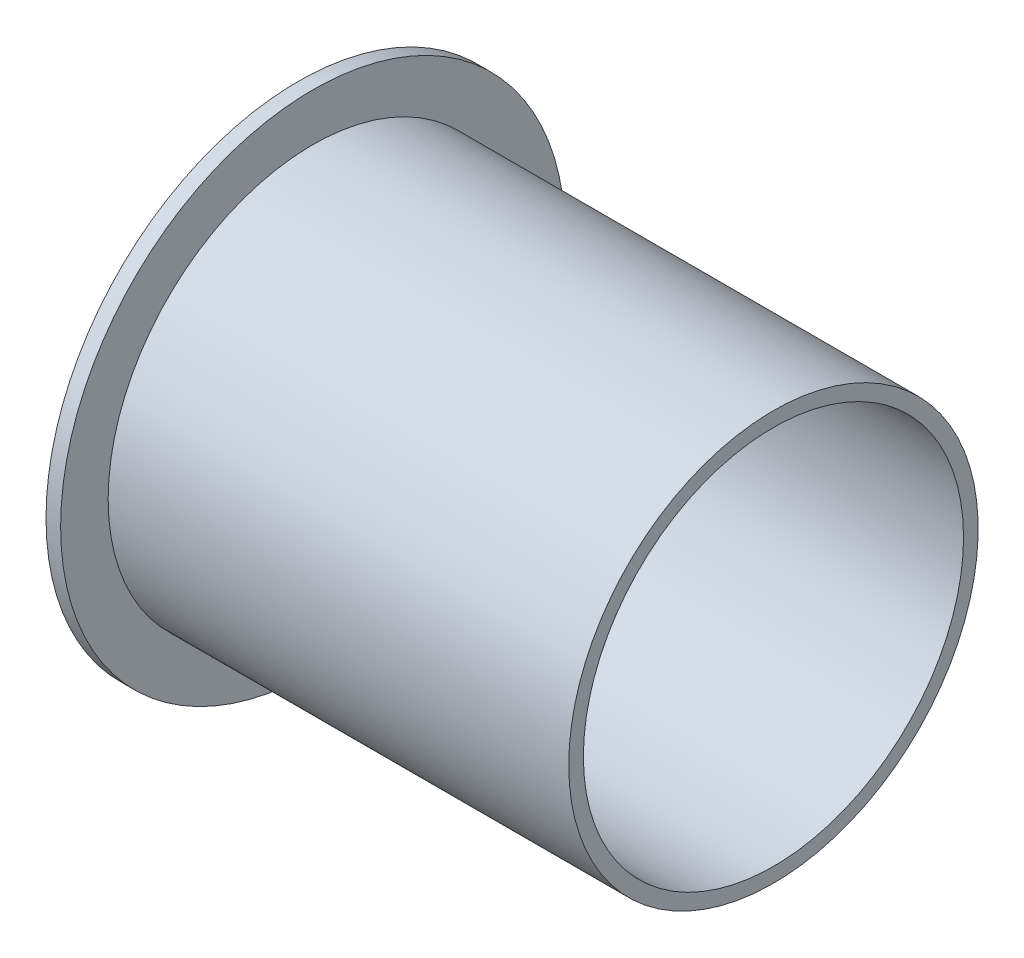
ISO-10303-21;
HEADER;
FILE_DESCRIPTION(('STEP AP214'),'2;1');
FILE_NAME('part.step','',(''),(''),'','','');
FILE_SCHEMA(('AUTOMOTIVE_DESIGN { 1 0 10303 214 1 1 1 1 }'));
ENDSEC;
DATA;
#1=APPLICATION_CONTEXT('core data for automotive mechanical design processes');
#2=APPLICATION_PROTOCOL_DEFINITION('international standard','automotive_design',2000,#1);
#3=PRODUCT_CONTEXT('',#1,'mechanical');
#4=PRODUCT('Part','Part','',(#3));
#5=PRODUCT_RELATED_PRODUCT_CATEGORY('part','',(#4));
#6=PRODUCT_DEFINITION_FORMATION('','',#4);
#7=PRODUCT_DEFINITION_CONTEXT('part definition',#1,'design');
#8=PRODUCT_DEFINITION('design','',#6,#7);
#9=PRODUCT_DEFINITION_SHAPE('','',#8);
#10=(LENGTH_UNIT() NAMED_UNIT(*) SI_UNIT(.MILLI.,.METRE.));
#11=(NAMED_UNIT(*) PLANE_ANGLE_UNIT() SI_UNIT($,.RADIAN.));
#12=(NAMED_UNIT(*) SI_UNIT($,.STERADIAN.) SOLID_ANGLE_UNIT());
#13=UNCERTAINTY_MEASURE_WITH_UNIT(LENGTH_MEASURE(1.E-05),#10,'distance_accuracy_value','');
#14=(GEOMETRIC_REPRESENTATION_CONTEXT(3) GLOBAL_UNCERTAINTY_ASSIGNED_CONTEXT((#13)) GLOBAL_UNIT_ASSIGNED_CONTEXT((#10,
#11,#12)) REPRESENTATION_CONTEXT('',''));
#15=CARTESIAN_POINT('',(0.,0.,0.));
#16=DIRECTION('',(0.,0.,1.));
#17=DIRECTION('',(1.,0.,0.));
#18=AXIS2_PLACEMENT_3D('',#15,#16,#17);
#19=CARTESIAN_POINT('',(-54.3054367049861,0.,0.));
#20=DIRECTION('',(-1.,0.,0.));
#21=DIRECTION('',(0.,0.,1.));
#22=AXIS2_PLACEMENT_3D('',#19,#20,#21);
#23=CYLINDRICAL_SURFACE('',#22,34.5);
#24=CARTESIAN_POINT('',(0.,0.,0.));
#25=DIRECTION('',(-1.,0.,0.));
#26=DIRECTION('',(0.,0.,1.));
#27=AXIS2_PLACEMENT_3D('',#24,#25,#26);
#28=CIRCLE('',#27,34.5);
#29=CARTESIAN_POINT('',(0.,0.,34.5));
#30=VERTEX_POINT('',#29);
#31=EDGE_CURVE('E10',#30,#30,#28,.T.);
#32=ORIENTED_EDGE('',*,*,#31,.F.);
#33=EDGE_LOOP('',(#32));
#34=FACE_BOUND('',#33,.T.);
#35=CARTESIAN_POINT('',(2.,0.,0.));
#36=DIRECTION('',(-1.,0.,0.));
#37=DIRECTION('',(0.,0.,1.));
#38=AXIS2_PLACEMENT_3D('',#35,#36,#37);
#39=CIRCLE('',#38,34.5);
#40=CARTESIAN_POINT('',(2.,0.,34.5));
#41=VERTEX_POINT('',#40);
#42=EDGE_CURVE('E53',#41,#41,#39,.T.);
#43=ORIENTED_EDGE('',*,*,#42,.T.);
#44=EDGE_LOOP('',(#43));
#45=FACE_BOUND('',#44,.T.);
#46=ADVANCED_FACE('F31',(#34,#45),#23,.T.);
#47=CARTESIAN_POINT('',(0.,0.,-34.5));
#48=DIRECTION('',(1.,0.,0.));
#49=DIRECTION('',(0.,0.,-1.));
#50=AXIS2_PLACEMENT_3D('',#47,#48,#49);
#51=PLANE('',#50);
#52=CARTESIAN_POINT('',(0.,0.,0.));
#53=DIRECTION('',(-1.,0.,0.));
#54=DIRECTION('',(0.,0.,1.));
#55=AXIS2_PLACEMENT_3D('',#52,#53,#54);
#56=CIRCLE('',#55,26.);
#57=CARTESIAN_POINT('',(0.,0.,26.));
#58=VERTEX_POINT('',#57);
#59=EDGE_CURVE('E37',#58,#58,#56,.T.);
#60=ORIENTED_EDGE('',*,*,#59,.F.);
#61=EDGE_LOOP('',(#60));
#62=FACE_BOUND('',#61,.T.);
#63=ORIENTED_EDGE('',*,*,#31,.T.);
#64=EDGE_LOOP('',(#63));
#65=FACE_BOUND('',#64,.T.);
#66=ADVANCED_FACE('F78',(#62,#65),#51,.F.);
#67=CARTESIAN_POINT('',(-54.3054367049861,0.,0.));
#68=DIRECTION('',(-1.,0.,0.));
#69=DIRECTION('',(0.,0.,1.));
#70=AXIS2_PLACEMENT_3D('',#67,#68,#69);
#71=CYLINDRICAL_SURFACE('',#70,26.);
#72=CARTESIAN_POINT('',(65.,0.,0.));
#73=DIRECTION('',(-1.,0.,0.));
#74=DIRECTION('',(0.,0.,1.));
#75=AXIS2_PLACEMENT_3D('',#72,#73,#74);
#76=CIRCLE('',#75,26.);
#77=CARTESIAN_POINT('',(65.,0.,26.));
#78=VERTEX_POINT('',#77);
#79=EDGE_CURVE('E41',#78,#78,#76,.T.);
#80=ORIENTED_EDGE('',*,*,#79,.F.);
#81=EDGE_LOOP('',(#80));
#82=FACE_BOUND('',#81,.T.);
#83=ORIENTED_EDGE('',*,*,#59,.T.);
#84=EDGE_LOOP('',(#83));
#85=FACE_BOUND('',#84,.T.);
#86=ADVANCED_FACE('F73',(#82,#85),#71,.F.);
#87=CARTESIAN_POINT('',(65.,0.,-26.));
#88=DIRECTION('',(-1.,0.,0.));
#89=DIRECTION('',(0.,0.,1.));
#90=AXIS2_PLACEMENT_3D('',#87,#88,#89);
#91=PLANE('',#90);
#92=CARTESIAN_POINT('',(65.,0.,0.));
#93=DIRECTION('',(-1.,0.,0.));
#94=DIRECTION('',(0.,0.,1.));
#95=AXIS2_PLACEMENT_3D('',#92,#93,#94);
#96=CIRCLE('',#95,28.);
#97=CARTESIAN_POINT('',(65.,0.,28.));
#98=VERTEX_POINT('',#97);
#99=EDGE_CURVE('E45',#98,#98,#96,.T.);
#100=ORIENTED_EDGE('',*,*,#99,.F.);
#101=EDGE_LOOP('',(#100));
#102=FACE_BOUND('',#101,.T.);
#103=ORIENTED_EDGE('',*,*,#79,.T.);
#104=EDGE_LOOP('',(#103));
#105=FACE_BOUND('',#104,.T.);
#106=ADVANCED_FACE('F67',(#102,#105),#91,.F.);
#107=CARTESIAN_POINT('',(-54.3054367049861,0.,0.));
#108=DIRECTION('',(-1.,0.,0.));
#109=DIRECTION('',(0.,0.,1.));
#110=AXIS2_PLACEMENT_3D('',#107,#108,#109);
#111=CYLINDRICAL_SURFACE('',#110,28.);
#112=CARTESIAN_POINT('',(2.,0.,0.));
#113=DIRECTION('',(-1.,0.,0.));
#114=DIRECTION('',(0.,0.,1.));
#115=AXIS2_PLACEMENT_3D('',#112,#113,#114);
#116=CIRCLE('',#115,28.);
#117=CARTESIAN_POINT('',(2.,0.,28.));
#118=VERTEX_POINT('',#117);
#119=EDGE_CURVE('E50',#118,#118,#116,.T.);
#120=ORIENTED_EDGE('',*,*,#119,.F.);
#121=EDGE_LOOP('',(#120));
#122=FACE_BOUND('',#121,.T.);
#123=ORIENTED_EDGE('',*,*,#99,.T.);
#124=EDGE_LOOP('',(#123));
#125=FACE_BOUND('',#124,.T.);
#126=ADVANCED_FACE('F61',(#122,#125),#111,.T.);
#127=CARTESIAN_POINT('',(2.,0.,-28.));
#128=DIRECTION('',(-1.,0.,0.));
#129=DIRECTION('',(0.,0.,1.));
#130=AXIS2_PLACEMENT_3D('',#127,#128,#129);
#131=PLANE('',#130);
#132=ORIENTED_EDGE('',*,*,#42,.F.);
#133=EDGE_LOOP('',(#132));
#134=FACE_BOUND('',#133,.T.);
#135=ORIENTED_EDGE('',*,*,#119,.T.);
#136=EDGE_LOOP('',(#135));
#137=FACE_BOUND('',#136,.T.);
#138=ADVANCED_FACE('F58',(#134,#137),#131,.F.);
#139=CLOSED_SHELL('',(#46,#66,#86,#106,#126,#138));
#140=MANIFOLD_SOLID_BREP('B2',#139);
#141=ADVANCED_BREP_SHAPE_REPRESENTATION('',(#18,#140),#14);
#142=SHAPE_DEFINITION_REPRESENTATION(#9,#141);
ENDSEC;
END-ISO-10303-21;
